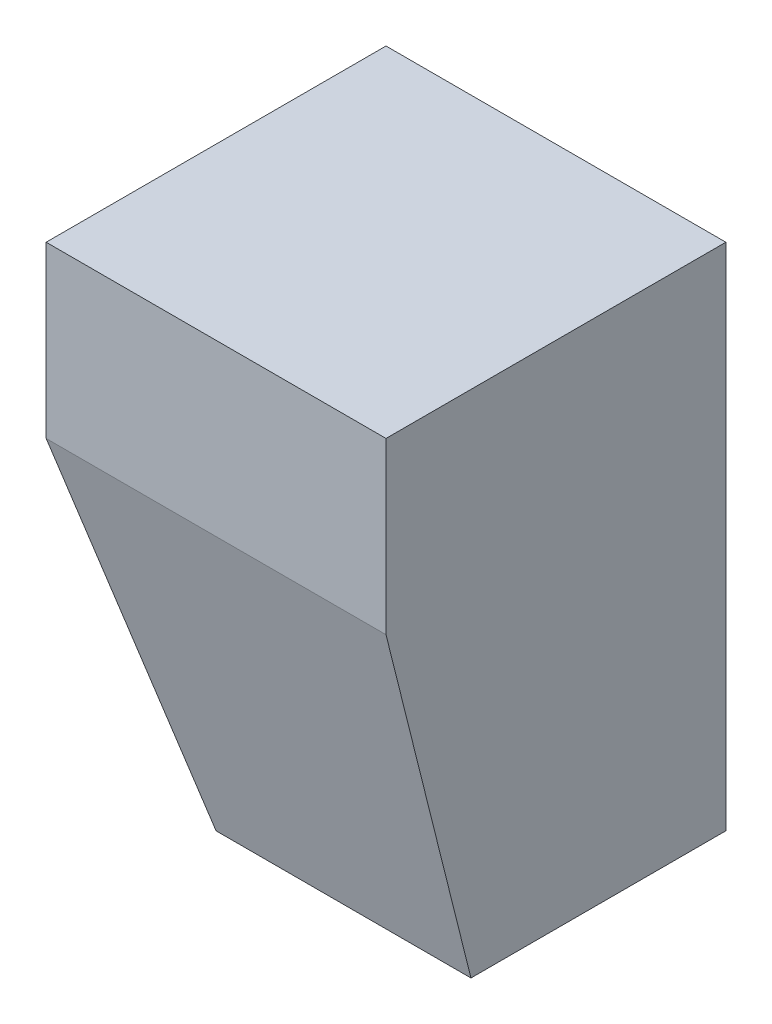
ISO-10303-21;
HEADER;
FILE_DESCRIPTION(('STEP AP214'),'2;1');
FILE_NAME('part.step','',(''),(''),'','','');
FILE_SCHEMA(('AUTOMOTIVE_DESIGN { 1 0 10303 214 1 1 1 1 }'));
ENDSEC;
DATA;
#1=APPLICATION_CONTEXT('core data for automotive mechanical design processes');
#2=APPLICATION_PROTOCOL_DEFINITION('international standard','automotive_design',2000,#1);
#3=PRODUCT_CONTEXT('',#1,'mechanical');
#4=PRODUCT('Part','Part','',(#3));
#5=PRODUCT_RELATED_PRODUCT_CATEGORY('part','',(#4));
#6=PRODUCT_DEFINITION_FORMATION('','',#4);
#7=PRODUCT_DEFINITION_CONTEXT('part definition',#1,'design');
#8=PRODUCT_DEFINITION('design','',#6,#7);
#9=PRODUCT_DEFINITION_SHAPE('','',#8);
#10=(LENGTH_UNIT() NAMED_UNIT(*) SI_UNIT(.MILLI.,.METRE.));
#11=(NAMED_UNIT(*) PLANE_ANGLE_UNIT() SI_UNIT($,.RADIAN.));
#12=(NAMED_UNIT(*) SI_UNIT($,.STERADIAN.) SOLID_ANGLE_UNIT());
#13=UNCERTAINTY_MEASURE_WITH_UNIT(LENGTH_MEASURE(1.E-05),#10,'distance_accuracy_value','');
#14=(GEOMETRIC_REPRESENTATION_CONTEXT(3) GLOBAL_UNCERTAINTY_ASSIGNED_CONTEXT((#13)) GLOBAL_UNIT_ASSIGNED_CONTEXT((#10,
#11,#12)) REPRESENTATION_CONTEXT('',''));
#15=CARTESIAN_POINT('',(0.,0.,0.));
#16=DIRECTION('',(0.,0.,1.));
#17=DIRECTION('',(1.,0.,0.));
#18=AXIS2_PLACEMENT_3D('',#15,#16,#17);
#19=CARTESIAN_POINT('',(-25.4,76.2,-25.4));
#20=DIRECTION('',(1.,0.,0.));
#21=DIRECTION('',(0.,0.,-1.));
#22=AXIS2_PLACEMENT_3D('',#19,#20,#21);
#23=PLANE('',#22);
#24=DIRECTION('',(0.,-1.,0.));
#25=VECTOR('',#24,1.);
#26=CARTESIAN_POINT('',(-25.4,76.2,-25.4));
#27=LINE('',#26,#25);
#28=CARTESIAN_POINT('',(-25.4,76.2,-25.4));
#29=VERTEX_POINT('',#28);
#30=CARTESIAN_POINT('',(-25.4,50.8000000000007,-25.4));
#31=VERTEX_POINT('',#30);
#32=EDGE_CURVE('E127',#29,#31,#27,.T.);
#33=ORIENTED_EDGE('',*,*,#32,.T.);
#34=DIRECTION('',(0.,0.,1.));
#35=VECTOR('',#34,1.);
#36=CARTESIAN_POINT('',(-25.4,50.8000000000007,12.7));
#37=LINE('',#36,#35);
#38=CARTESIAN_POINT('',(-25.4,50.8000000000007,25.4));
#39=VERTEX_POINT('',#38);
#40=EDGE_CURVE('E107',#31,#39,#37,.T.);
#41=ORIENTED_EDGE('',*,*,#40,.T.);
#42=DIRECTION('',(0.,-1.,0.));
#43=VECTOR('',#42,1.);
#44=CARTESIAN_POINT('',(-25.4,76.2,25.4));
#45=LINE('',#44,#43);
#46=CARTESIAN_POINT('',(-25.4,76.2,25.4));
#47=VERTEX_POINT('',#46);
#48=EDGE_CURVE('E88',#47,#39,#45,.T.);
#49=ORIENTED_EDGE('',*,*,#48,.F.);
#50=DIRECTION('',(0.,0.,1.));
#51=VECTOR('',#50,1.);
#52=CARTESIAN_POINT('',(-25.4,76.2,-25.4));
#53=LINE('',#52,#51);
#54=EDGE_CURVE('E94',#29,#47,#53,.T.);
#55=ORIENTED_EDGE('',*,*,#54,.F.);
#56=EDGE_LOOP('',(#33,#41,#49,#55));
#57=FACE_BOUND('',#56,.T.);
#58=ADVANCED_FACE('F33',(#57),#23,.F.);
#59=CARTESIAN_POINT('',(25.4,76.2,25.4));
#60=DIRECTION('',(0.,0.,-1.));
#61=DIRECTION('',(-1.,0.,0.));
#62=AXIS2_PLACEMENT_3D('',#59,#60,#61);
#63=PLANE('',#62);
#64=ORIENTED_EDGE('',*,*,#48,.T.);
#65=DIRECTION('',(1.,0.,0.));
#66=VECTOR('',#65,1.);
#67=CARTESIAN_POINT('',(25.4,50.8000000000007,25.4));
#68=LINE('',#67,#66);
#69=CARTESIAN_POINT('',(25.4,50.8000000000007,25.4));
#70=VERTEX_POINT('',#69);
#71=EDGE_CURVE('E108',#39,#70,#68,.T.);
#72=ORIENTED_EDGE('',*,*,#71,.T.);
#73=DIRECTION('',(0.,-1.,0.));
#74=VECTOR('',#73,1.);
#75=CARTESIAN_POINT('',(25.4,76.2,25.4));
#76=LINE('',#75,#74);
#77=CARTESIAN_POINT('',(25.4,76.2,25.4));
#78=VERTEX_POINT('',#77);
#79=EDGE_CURVE('E90',#78,#70,#76,.T.);
#80=ORIENTED_EDGE('',*,*,#79,.F.);
#81=DIRECTION('',(1.,0.,0.));
#82=VECTOR('',#81,1.);
#83=CARTESIAN_POINT('',(25.4,76.2,25.4));
#84=LINE('',#83,#82);
#85=EDGE_CURVE('E83',#47,#78,#84,.T.);
#86=ORIENTED_EDGE('',*,*,#85,.F.);
#87=EDGE_LOOP('',(#64,#72,#80,#86));
#88=FACE_BOUND('',#87,.T.);
#89=ADVANCED_FACE('F85',(#88),#63,.F.);
#90=CARTESIAN_POINT('',(25.4,76.2,-25.4));
#91=DIRECTION('',(-1.,0.,0.));
#92=DIRECTION('',(0.,0.,1.));
#93=AXIS2_PLACEMENT_3D('',#90,#91,#92);
#94=PLANE('',#93);
#95=ORIENTED_EDGE('',*,*,#79,.T.);
#96=DIRECTION('',(0.,-0.970142500145333,-0.24253562503633));
#97=VECTOR('',#96,1.);
#98=CARTESIAN_POINT('',(25.4,50.8000000000007,25.4));
#99=LINE('',#98,#97);
#100=CARTESIAN_POINT('',(25.4,0.,12.7));
#101=VERTEX_POINT('',#100);
#102=EDGE_CURVE('E110',#70,#101,#99,.T.);
#103=ORIENTED_EDGE('',*,*,#102,.T.);
#104=DIRECTION('',(0.,0.,-1.));
#105=VECTOR('',#104,1.);
#106=CARTESIAN_POINT('',(25.4,0.,-25.4));
#107=LINE('',#106,#105);
#108=CARTESIAN_POINT('',(25.4,0.,-25.4));
#109=VERTEX_POINT('',#108);
#110=EDGE_CURVE('E122',#101,#109,#107,.T.);
#111=ORIENTED_EDGE('',*,*,#110,.T.);
#112=DIRECTION('',(0.,-1.,0.));
#113=VECTOR('',#112,1.);
#114=CARTESIAN_POINT('',(25.4,76.2,-25.4));
#115=LINE('',#114,#113);
#116=CARTESIAN_POINT('',(25.4,76.2,-25.4));
#117=VERTEX_POINT('',#116);
#118=EDGE_CURVE('E112',#117,#109,#115,.T.);
#119=ORIENTED_EDGE('',*,*,#118,.F.);
#120=DIRECTION('',(0.,0.,-1.));
#121=VECTOR('',#120,1.);
#122=CARTESIAN_POINT('',(25.4,76.2,-25.4));
#123=LINE('',#122,#121);
#124=EDGE_CURVE('E93',#78,#117,#123,.T.);
#125=ORIENTED_EDGE('',*,*,#124,.F.);
#126=EDGE_LOOP('',(#95,#103,#111,#119,#125));
#127=FACE_BOUND('',#126,.T.);
#128=ADVANCED_FACE('F136',(#127),#94,.F.);
#129=CARTESIAN_POINT('',(25.4,76.2,-25.4));
#130=DIRECTION('',(0.,0.,1.));
#131=DIRECTION('',(1.,0.,0.));
#132=AXIS2_PLACEMENT_3D('',#129,#130,#131);
#133=PLANE('',#132);
#134=DIRECTION('',(-1.,0.,0.));
#135=VECTOR('',#134,1.);
#136=CARTESIAN_POINT('',(25.4,0.,-25.4));
#137=LINE('',#136,#135);
#138=CARTESIAN_POINT('',(-12.7,0.,-25.4));
#139=VERTEX_POINT('',#138);
#140=EDGE_CURVE('E103',#109,#139,#137,.T.);
#141=ORIENTED_EDGE('',*,*,#140,.T.);
#142=DIRECTION('',(-0.24253562503633,0.970142500145333,0.));
#143=VECTOR('',#142,1.);
#144=CARTESIAN_POINT('',(-25.4,50.8000000000007,-25.4));
#145=LINE('',#144,#143);
#146=EDGE_CURVE('E11',#139,#31,#145,.T.);
#147=ORIENTED_EDGE('',*,*,#146,.T.);
#148=ORIENTED_EDGE('',*,*,#32,.F.);
#149=DIRECTION('',(-1.,0.,0.));
#150=VECTOR('',#149,1.);
#151=CARTESIAN_POINT('',(25.4,76.2,-25.4));
#152=LINE('',#151,#150);
#153=EDGE_CURVE('E99',#117,#29,#152,.T.);
#154=ORIENTED_EDGE('',*,*,#153,.F.);
#155=ORIENTED_EDGE('',*,*,#118,.T.);
#156=EDGE_LOOP('',(#141,#147,#148,#154,#155));
#157=FACE_BOUND('',#156,.T.);
#158=ADVANCED_FACE('F126',(#157),#133,.F.);
#159=CARTESIAN_POINT('',(0.,76.2,0.));
#160=DIRECTION('',(0.,-1.,0.));
#161=DIRECTION('',(0.,0.,-1.));
#162=AXIS2_PLACEMENT_3D('',#159,#160,#161);
#163=PLANE('',#162);
#164=ORIENTED_EDGE('',*,*,#54,.T.);
#165=ORIENTED_EDGE('',*,*,#85,.T.);
#166=ORIENTED_EDGE('',*,*,#124,.T.);
#167=ORIENTED_EDGE('',*,*,#153,.T.);
#168=EDGE_LOOP('',(#164,#165,#166,#167));
#169=FACE_BOUND('',#168,.T.);
#170=ADVANCED_FACE('F97',(#169),#163,.F.);
#171=CARTESIAN_POINT('',(0.,0.,0.));
#172=DIRECTION('',(0.,-1.,0.));
#173=DIRECTION('',(0.,0.,-1.));
#174=AXIS2_PLACEMENT_3D('',#171,#172,#173);
#175=PLANE('',#174);
#176=DIRECTION('',(-1.,0.,0.));
#177=VECTOR('',#176,1.);
#178=CARTESIAN_POINT('',(-25.4,0.,12.7));
#179=LINE('',#178,#177);
#180=CARTESIAN_POINT('',(-12.7,0.,12.7));
#181=VERTEX_POINT('',#180);
#182=EDGE_CURVE('E117',#101,#181,#179,.T.);
#183=ORIENTED_EDGE('',*,*,#182,.T.);
#184=DIRECTION('',(0.,0.,-1.));
#185=VECTOR('',#184,1.);
#186=CARTESIAN_POINT('',(-12.7,0.,-25.4));
#187=LINE('',#186,#185);
#188=EDGE_CURVE('E41',#181,#139,#187,.T.);
#189=ORIENTED_EDGE('',*,*,#188,.T.);
#190=ORIENTED_EDGE('',*,*,#140,.F.);
#191=ORIENTED_EDGE('',*,*,#110,.F.);
#192=EDGE_LOOP('',(#183,#189,#190,#191));
#193=FACE_BOUND('',#192,.T.);
#194=ADVANCED_FACE('F121',(#193),#175,.T.);
#195=CARTESIAN_POINT('',(25.4,50.8000000000007,25.4));
#196=DIRECTION('',(0.,-0.24253562503633,0.970142500145333));
#197=DIRECTION('',(-1.,0.,0.));
#198=AXIS2_PLACEMENT_3D('',#195,#196,#197);
#199=PLANE('',#198);
#200=ORIENTED_EDGE('',*,*,#71,.F.);
#201=DIRECTION('',(0.235702260395513,-0.942809041582065,-0.235702260395513));
#202=VECTOR('',#201,1.);
#203=CARTESIAN_POINT('',(-22.5777777777778,39.5111111111119,22.5777777777779));
#204=LINE('',#203,#202);
#205=EDGE_CURVE('E55',#39,#181,#204,.T.);
#206=ORIENTED_EDGE('',*,*,#205,.T.);
#207=ORIENTED_EDGE('',*,*,#182,.F.);
#208=ORIENTED_EDGE('',*,*,#102,.F.);
#209=EDGE_LOOP('',(#200,#206,#207,#208));
#210=FACE_BOUND('',#209,.T.);
#211=ADVANCED_FACE('F137',(#210),#199,.T.);
#212=CARTESIAN_POINT('',(-25.4,50.8000000000007,-25.4));
#213=DIRECTION('',(-0.970142500145333,-0.24253562503633,0.));
#214=DIRECTION('',(0.,0.,-1.));
#215=AXIS2_PLACEMENT_3D('',#212,#213,#214);
#216=PLANE('',#215);
#217=ORIENTED_EDGE('',*,*,#146,.F.);
#218=ORIENTED_EDGE('',*,*,#188,.F.);
#219=ORIENTED_EDGE('',*,*,#205,.F.);
#220=ORIENTED_EDGE('',*,*,#40,.F.);
#221=EDGE_LOOP('',(#217,#218,#219,#220));
#222=FACE_BOUND('',#221,.T.);
#223=ADVANCED_FACE('F35',(#222),#216,.T.);
#224=CLOSED_SHELL('',(#58,#89,#128,#158,#170,#194,#211,#223));
#225=MANIFOLD_SOLID_BREP('B2',#224);
#226=ADVANCED_BREP_SHAPE_REPRESENTATION('',(#18,#225),#14);
#227=SHAPE_DEFINITION_REPRESENTATION(#9,#226);
ENDSEC;
END-ISO-10303-21;
